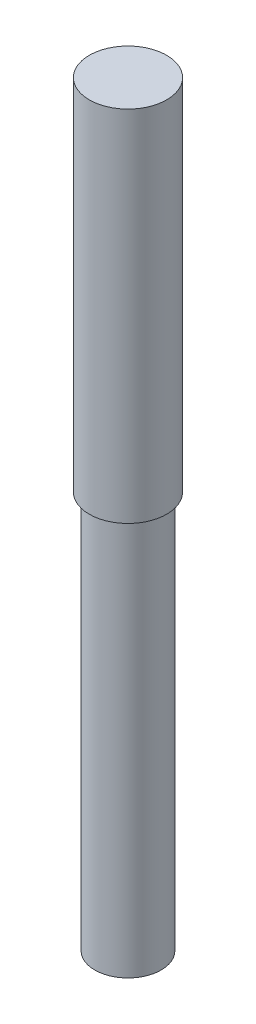
ISO-10303-21;
HEADER;
FILE_DESCRIPTION(('STEP AP214'),'2;1');
FILE_NAME('part.step','',(''),(''),'','','');
FILE_SCHEMA(('AUTOMOTIVE_DESIGN { 1 0 10303 214 1 1 1 1 }'));
ENDSEC;
DATA;
#1=APPLICATION_CONTEXT('core data for automotive mechanical design processes');
#2=APPLICATION_PROTOCOL_DEFINITION('international standard','automotive_design',2000,#1);
#3=PRODUCT_CONTEXT('',#1,'mechanical');
#4=PRODUCT('Part','Part','',(#3));
#5=PRODUCT_RELATED_PRODUCT_CATEGORY('part','',(#4));
#6=PRODUCT_DEFINITION_FORMATION('','',#4);
#7=PRODUCT_DEFINITION_CONTEXT('part definition',#1,'design');
#8=PRODUCT_DEFINITION('design','',#6,#7);
#9=PRODUCT_DEFINITION_SHAPE('','',#8);
#10=(LENGTH_UNIT() NAMED_UNIT(*) SI_UNIT(.MILLI.,.METRE.));
#11=(NAMED_UNIT(*) PLANE_ANGLE_UNIT() SI_UNIT($,.RADIAN.));
#12=(NAMED_UNIT(*) SI_UNIT($,.STERADIAN.) SOLID_ANGLE_UNIT());
#13=UNCERTAINTY_MEASURE_WITH_UNIT(LENGTH_MEASURE(1.E-05),#10,'distance_accuracy_value','');
#14=(GEOMETRIC_REPRESENTATION_CONTEXT(3) GLOBAL_UNCERTAINTY_ASSIGNED_CONTEXT((#13)) GLOBAL_UNIT_ASSIGNED_CONTEXT((#10,
#11,#12)) REPRESENTATION_CONTEXT('',''));
#15=CARTESIAN_POINT('',(0.,0.,0.));
#16=DIRECTION('',(0.,0.,1.));
#17=DIRECTION('',(1.,0.,0.));
#18=AXIS2_PLACEMENT_3D('',#15,#16,#17);
#19=CARTESIAN_POINT('',(0.,72.,0.));
#20=DIRECTION('',(0.,-1.,0.));
#21=DIRECTION('',(0.,0.,-1.));
#22=AXIS2_PLACEMENT_3D('',#19,#20,#21);
#23=CYLINDRICAL_SURFACE('',#22,6.);
#24=CARTESIAN_POINT('',(0.,72.,0.));
#25=DIRECTION('',(0.,1.,0.));
#26=DIRECTION('',(0.,0.,1.));
#27=AXIS2_PLACEMENT_3D('',#24,#25,#26);
#28=CIRCLE('',#27,6.);
#29=CARTESIAN_POINT('',(0.,72.,6.));
#30=VERTEX_POINT('',#29);
#31=EDGE_CURVE('E10',#30,#30,#28,.T.);
#32=ORIENTED_EDGE('',*,*,#31,.F.);
#33=EDGE_LOOP('',(#32));
#34=FACE_BOUND('',#33,.T.);
#35=CARTESIAN_POINT('',(0.,0.,0.));
#36=DIRECTION('',(0.,1.,0.));
#37=DIRECTION('',(0.,0.,1.));
#38=AXIS2_PLACEMENT_3D('',#35,#36,#37);
#39=CIRCLE('',#38,6.);
#40=CARTESIAN_POINT('',(0.,0.,6.));
#41=VERTEX_POINT('',#40);
#42=EDGE_CURVE('E34',#41,#41,#39,.T.);
#43=ORIENTED_EDGE('',*,*,#42,.T.);
#44=EDGE_LOOP('',(#43));
#45=FACE_BOUND('',#44,.T.);
#46=ADVANCED_FACE('F31',(#34,#45),#23,.T.);
#47=CARTESIAN_POINT('',(0.,0.,0.));
#48=DIRECTION('',(0.,1.,0.));
#49=DIRECTION('',(0.,0.,1.));
#50=AXIS2_PLACEMENT_3D('',#47,#48,#49);
#51=PLANE('',#50);
#52=ORIENTED_EDGE('',*,*,#42,.F.);
#53=EDGE_LOOP('',(#52));
#54=FACE_BOUND('',#53,.T.);
#55=ADVANCED_FACE('F59',(#54),#51,.F.);
#56=CARTESIAN_POINT('',(0.,72.,0.));
#57=DIRECTION('',(0.,1.,0.));
#58=DIRECTION('',(0.,0.,1.));
#59=AXIS2_PLACEMENT_3D('',#56,#57,#58);
#60=PLANE('',#59);
#61=CARTESIAN_POINT('',(0.,72.,0.));
#62=DIRECTION('',(0.,1.,0.));
#63=DIRECTION('',(0.,0.,1.));
#64=AXIS2_PLACEMENT_3D('',#61,#62,#63);
#65=CIRCLE('',#64,7.);
#66=CARTESIAN_POINT('',(0.,72.,7.));
#67=VERTEX_POINT('',#66);
#68=EDGE_CURVE('E43',#67,#67,#65,.T.);
#69=ORIENTED_EDGE('',*,*,#68,.F.);
#70=EDGE_LOOP('',(#69));
#71=FACE_BOUND('',#70,.T.);
#72=ORIENTED_EDGE('',*,*,#31,.T.);
#73=EDGE_LOOP('',(#72));
#74=FACE_BOUND('',#73,.T.);
#75=ADVANCED_FACE('F54',(#71,#74),#60,.F.);
#76=CARTESIAN_POINT('',(0.,137.,0.));
#77=DIRECTION('',(0.,-1.,0.));
#78=DIRECTION('',(0.,0.,-1.));
#79=AXIS2_PLACEMENT_3D('',#76,#77,#78);
#80=CYLINDRICAL_SURFACE('',#79,7.);
#81=CARTESIAN_POINT('',(0.,137.,0.));
#82=DIRECTION('',(0.,1.,0.));
#83=DIRECTION('',(0.,0.,1.));
#84=AXIS2_PLACEMENT_3D('',#81,#82,#83);
#85=CIRCLE('',#84,7.);
#86=CARTESIAN_POINT('',(0.,137.,7.));
#87=VERTEX_POINT('',#86);
#88=EDGE_CURVE('E41',#87,#87,#85,.T.);
#89=ORIENTED_EDGE('',*,*,#88,.F.);
#90=EDGE_LOOP('',(#89));
#91=FACE_BOUND('',#90,.T.);
#92=ORIENTED_EDGE('',*,*,#68,.T.);
#93=EDGE_LOOP('',(#92));
#94=FACE_BOUND('',#93,.T.);
#95=ADVANCED_FACE('F51',(#91,#94),#80,.T.);
#96=CARTESIAN_POINT('',(0.,137.,0.));
#97=DIRECTION('',(0.,1.,0.));
#98=DIRECTION('',(0.,0.,1.));
#99=AXIS2_PLACEMENT_3D('',#96,#97,#98);
#100=PLANE('',#99);
#101=ORIENTED_EDGE('',*,*,#88,.T.);
#102=EDGE_LOOP('',(#101));
#103=FACE_BOUND('',#102,.T.);
#104=ADVANCED_FACE('F49',(#103),#100,.T.);
#105=CLOSED_SHELL('',(#46,#55,#75,#95,#104));
#106=MANIFOLD_SOLID_BREP('B2',#105);
#107=ADVANCED_BREP_SHAPE_REPRESENTATION('',(#18,#106),#14);
#108=SHAPE_DEFINITION_REPRESENTATION(#9,#107);
ENDSEC;
END-ISO-10303-21;
